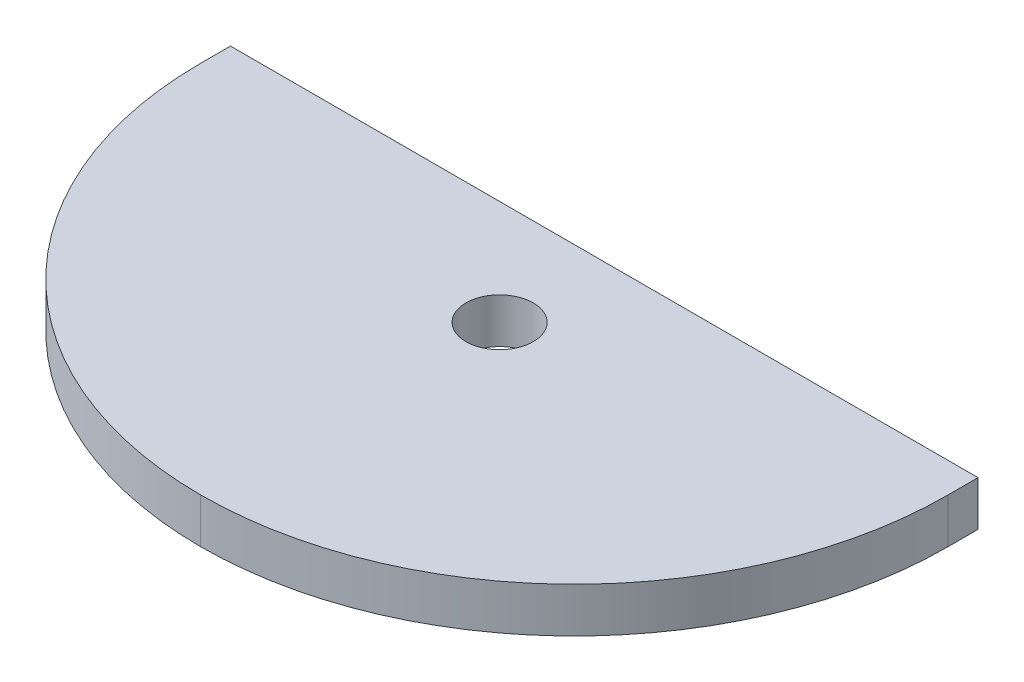
ISO-10303-21;
HEADER;
FILE_DESCRIPTION(('STEP AP214'),'2;1');
FILE_NAME('part.step','',(''),(''),'','','');
FILE_SCHEMA(('AUTOMOTIVE_DESIGN { 1 0 10303 214 1 1 1 1 }'));
ENDSEC;
DATA;
#1=APPLICATION_CONTEXT('core data for automotive mechanical design processes');
#2=APPLICATION_PROTOCOL_DEFINITION('international standard','automotive_design',2000,#1);
#3=PRODUCT_CONTEXT('',#1,'mechanical');
#4=PRODUCT('Part','Part','',(#3));
#5=PRODUCT_RELATED_PRODUCT_CATEGORY('part','',(#4));
#6=PRODUCT_DEFINITION_FORMATION('','',#4);
#7=PRODUCT_DEFINITION_CONTEXT('part definition',#1,'design');
#8=PRODUCT_DEFINITION('design','',#6,#7);
#9=PRODUCT_DEFINITION_SHAPE('','',#8);
#10=(LENGTH_UNIT() NAMED_UNIT(*) SI_UNIT(.MILLI.,.METRE.));
#11=(NAMED_UNIT(*) PLANE_ANGLE_UNIT() SI_UNIT($,.RADIAN.));
#12=(NAMED_UNIT(*) SI_UNIT($,.STERADIAN.) SOLID_ANGLE_UNIT());
#13=UNCERTAINTY_MEASURE_WITH_UNIT(LENGTH_MEASURE(1.E-05),#10,'distance_accuracy_value','');
#14=(GEOMETRIC_REPRESENTATION_CONTEXT(3) GLOBAL_UNCERTAINTY_ASSIGNED_CONTEXT((#13)) GLOBAL_UNIT_ASSIGNED_CONTEXT((#10,
#11,#12)) REPRESENTATION_CONTEXT('',''));
#15=CARTESIAN_POINT('',(0.,0.,0.));
#16=DIRECTION('',(0.,0.,1.));
#17=DIRECTION('',(1.,0.,0.));
#18=AXIS2_PLACEMENT_3D('',#15,#16,#17);
#19=CARTESIAN_POINT('',(0.,3.,0.));
#20=DIRECTION('',(1.,0.,0.));
#21=DIRECTION('',(0.,0.,-1.));
#22=AXIS2_PLACEMENT_3D('',#19,#20,#21);
#23=PLANE('',#22);
#24=DIRECTION('',(0.,0.,1.));
#25=VECTOR('',#24,1.);
#26=CARTESIAN_POINT('',(0.,0.,0.));
#27=LINE('',#26,#25);
#28=CARTESIAN_POINT('',(0.,0.,-27.));
#29=VERTEX_POINT('',#28);
#30=CARTESIAN_POINT('',(0.,0.,-25.));
#31=VERTEX_POINT('',#30);
#32=EDGE_CURVE('E107',#29,#31,#27,.T.);
#33=ORIENTED_EDGE('',*,*,#32,.T.);
#34=DIRECTION('',(0.,-1.,0.));
#35=VECTOR('',#34,1.);
#36=CARTESIAN_POINT('',(0.,3.,-25.));
#37=LINE('',#36,#35);
#38=CARTESIAN_POINT('',(0.,3.,-25.));
#39=VERTEX_POINT('',#38);
#40=EDGE_CURVE('E11',#31,#39,#37,.F.);
#41=ORIENTED_EDGE('',*,*,#40,.T.);
#42=DIRECTION('',(0.,0.,1.));
#43=VECTOR('',#42,1.);
#44=CARTESIAN_POINT('',(0.,3.,0.));
#45=LINE('',#44,#43);
#46=CARTESIAN_POINT('',(0.,3.,-27.));
#47=VERTEX_POINT('',#46);
#48=EDGE_CURVE('E89',#47,#39,#45,.T.);
#49=ORIENTED_EDGE('',*,*,#48,.F.);
#50=DIRECTION('',(0.,-1.,0.));
#51=VECTOR('',#50,1.);
#52=CARTESIAN_POINT('',(0.,3.,-27.));
#53=LINE('',#52,#51);
#54=EDGE_CURVE('E99',#47,#29,#53,.T.);
#55=ORIENTED_EDGE('',*,*,#54,.T.);
#56=EDGE_LOOP('',(#33,#41,#49,#55));
#57=FACE_BOUND('',#56,.T.);
#58=ADVANCED_FACE('F33',(#57),#23,.F.);
#59=CARTESIAN_POINT('',(50.,3.,0.));
#60=DIRECTION('',(-1.,0.,0.));
#61=DIRECTION('',(0.,0.,1.));
#62=AXIS2_PLACEMENT_3D('',#59,#60,#61);
#63=PLANE('',#62);
#64=DIRECTION('',(0.,0.,-1.));
#65=VECTOR('',#64,1.);
#66=CARTESIAN_POINT('',(50.,3.,0.));
#67=LINE('',#66,#65);
#68=CARTESIAN_POINT('',(50.,3.,-25.));
#69=VERTEX_POINT('',#68);
#70=CARTESIAN_POINT('',(50.,3.,-27.));
#71=VERTEX_POINT('',#70);
#72=EDGE_CURVE('E79',#69,#71,#67,.T.);
#73=ORIENTED_EDGE('',*,*,#72,.F.);
#74=DIRECTION('',(0.,-1.,0.));
#75=VECTOR('',#74,1.);
#76=CARTESIAN_POINT('',(50.,3.,-25.));
#77=LINE('',#76,#75);
#78=CARTESIAN_POINT('',(50.,0.,-25.));
#79=VERTEX_POINT('',#78);
#80=EDGE_CURVE('E98',#69,#79,#77,.T.);
#81=ORIENTED_EDGE('',*,*,#80,.T.);
#82=DIRECTION('',(0.,0.,-1.));
#83=VECTOR('',#82,1.);
#84=CARTESIAN_POINT('',(50.,0.,0.));
#85=LINE('',#84,#83);
#86=CARTESIAN_POINT('',(50.,0.,-27.));
#87=VERTEX_POINT('',#86);
#88=EDGE_CURVE('E95',#79,#87,#85,.T.);
#89=ORIENTED_EDGE('',*,*,#88,.T.);
#90=DIRECTION('',(0.,-1.,0.));
#91=VECTOR('',#90,1.);
#92=CARTESIAN_POINT('',(50.,3.,-27.));
#93=LINE('',#92,#91);
#94=EDGE_CURVE('E92',#71,#87,#93,.T.);
#95=ORIENTED_EDGE('',*,*,#94,.F.);
#96=EDGE_LOOP('',(#73,#81,#89,#95));
#97=FACE_BOUND('',#96,.T.);
#98=ADVANCED_FACE('F93',(#97),#63,.F.);
#99=CARTESIAN_POINT('',(0.,3.,-27.));
#100=DIRECTION('',(0.,0.,1.));
#101=DIRECTION('',(1.,0.,0.));
#102=AXIS2_PLACEMENT_3D('',#99,#100,#101);
#103=PLANE('',#102);
#104=DIRECTION('',(-1.,0.,0.));
#105=VECTOR('',#104,1.);
#106=CARTESIAN_POINT('',(0.,0.,-27.));
#107=LINE('',#106,#105);
#108=EDGE_CURVE('E110',#87,#29,#107,.T.);
#109=ORIENTED_EDGE('',*,*,#108,.T.);
#110=ORIENTED_EDGE('',*,*,#54,.F.);
#111=DIRECTION('',(-1.,0.,0.));
#112=VECTOR('',#111,1.);
#113=CARTESIAN_POINT('',(0.,3.,-27.));
#114=LINE('',#113,#112);
#115=EDGE_CURVE('E83',#71,#47,#114,.T.);
#116=ORIENTED_EDGE('',*,*,#115,.F.);
#117=ORIENTED_EDGE('',*,*,#94,.T.);
#118=EDGE_LOOP('',(#109,#110,#116,#117));
#119=FACE_BOUND('',#118,.T.);
#120=ADVANCED_FACE('F101',(#119),#103,.F.);
#121=CARTESIAN_POINT('',(0.,3.,0.));
#122=DIRECTION('',(0.,-1.,0.));
#123=DIRECTION('',(0.,0.,-1.));
#124=AXIS2_PLACEMENT_3D('',#121,#122,#123);
#125=PLANE('',#124);
#126=CARTESIAN_POINT('',(25.,3.,-20.));
#127=DIRECTION('',(0.,1.,0.));
#128=DIRECTION('',(0.,0.,1.));
#129=AXIS2_PLACEMENT_3D('',#126,#127,#128);
#130=CIRCLE('',#129,2.25);
#131=CARTESIAN_POINT('',(25.,3.,-17.75));
#132=VERTEX_POINT('',#131);
#133=EDGE_CURVE('E128',#132,#132,#130,.T.);
#134=ORIENTED_EDGE('',*,*,#133,.F.);
#135=EDGE_LOOP('',(#134));
#136=FACE_BOUND('',#135,.T.);
#137=CARTESIAN_POINT('',(25.,3.,-25.));
#138=DIRECTION('',(0.,-1.,0.));
#139=DIRECTION('',(0.,0.,-1.));
#140=AXIS2_PLACEMENT_3D('',#137,#138,#139);
#141=CIRCLE('',#140,25.);
#142=CARTESIAN_POINT('',(25.,3.,0.));
#143=VERTEX_POINT('',#142);
#144=EDGE_CURVE('E49',#39,#143,#141,.F.);
#145=ORIENTED_EDGE('',*,*,#144,.T.);
#146=CARTESIAN_POINT('',(25.,3.,-25.));
#147=DIRECTION('',(0.,-1.,0.));
#148=DIRECTION('',(0.,0.,-1.));
#149=AXIS2_PLACEMENT_3D('',#146,#147,#148);
#150=CIRCLE('',#149,25.);
#151=EDGE_CURVE('E42',#143,#69,#150,.F.);
#152=ORIENTED_EDGE('',*,*,#151,.T.);
#153=ORIENTED_EDGE('',*,*,#72,.T.);
#154=ORIENTED_EDGE('',*,*,#115,.T.);
#155=ORIENTED_EDGE('',*,*,#48,.T.);
#156=EDGE_LOOP('',(#145,#152,#153,#154,#155));
#157=FACE_BOUND('',#156,.T.);
#158=ADVANCED_FACE('F81',(#136,#157),#125,.F.);
#159=CARTESIAN_POINT('',(0.,0.,0.));
#160=DIRECTION('',(0.,-1.,0.));
#161=DIRECTION('',(0.,0.,-1.));
#162=AXIS2_PLACEMENT_3D('',#159,#160,#161);
#163=PLANE('',#162);
#164=CARTESIAN_POINT('',(25.,0.,-20.));
#165=DIRECTION('',(0.,1.,0.));
#166=DIRECTION('',(0.,0.,1.));
#167=AXIS2_PLACEMENT_3D('',#164,#165,#166);
#168=CIRCLE('',#167,2.25);
#169=CARTESIAN_POINT('',(25.,0.,-17.75));
#170=VERTEX_POINT('',#169);
#171=EDGE_CURVE('E126',#170,#170,#168,.T.);
#172=ORIENTED_EDGE('',*,*,#171,.T.);
#173=EDGE_LOOP('',(#172));
#174=FACE_BOUND('',#173,.T.);
#175=ORIENTED_EDGE('',*,*,#88,.F.);
#176=CARTESIAN_POINT('',(25.,0.,-25.));
#177=DIRECTION('',(0.,-1.,0.));
#178=DIRECTION('',(0.,0.,-1.));
#179=AXIS2_PLACEMENT_3D('',#176,#177,#178);
#180=CIRCLE('',#179,25.);
#181=CARTESIAN_POINT('',(25.,0.,0.));
#182=VERTEX_POINT('',#181);
#183=EDGE_CURVE('E115',#79,#182,#180,.T.);
#184=ORIENTED_EDGE('',*,*,#183,.T.);
#185=CARTESIAN_POINT('',(25.,0.,-25.));
#186=DIRECTION('',(0.,-1.,0.));
#187=DIRECTION('',(0.,0.,-1.));
#188=AXIS2_PLACEMENT_3D('',#185,#186,#187);
#189=CIRCLE('',#188,25.);
#190=EDGE_CURVE('E113',#182,#31,#189,.T.);
#191=ORIENTED_EDGE('',*,*,#190,.T.);
#192=ORIENTED_EDGE('',*,*,#32,.F.);
#193=ORIENTED_EDGE('',*,*,#108,.F.);
#194=EDGE_LOOP('',(#175,#184,#191,#192,#193));
#195=FACE_BOUND('',#194,.T.);
#196=ADVANCED_FACE('F120',(#174,#195),#163,.T.);
#197=CARTESIAN_POINT('',(25.,3.,-25.));
#198=DIRECTION('',(0.,-1.,0.));
#199=DIRECTION('',(0.,0.,-1.));
#200=AXIS2_PLACEMENT_3D('',#197,#198,#199);
#201=CYLINDRICAL_SURFACE('',#200,25.);
#202=DIRECTION('',(0.,-1.,0.));
#203=VECTOR('',#202,1.);
#204=CARTESIAN_POINT('',(25.,3.,0.));
#205=LINE('',#204,#203);
#206=EDGE_CURVE('E37',#143,#182,#205,.T.);
#207=ORIENTED_EDGE('',*,*,#206,.F.);
#208=ORIENTED_EDGE('',*,*,#144,.F.);
#209=ORIENTED_EDGE('',*,*,#40,.F.);
#210=ORIENTED_EDGE('',*,*,#190,.F.);
#211=EDGE_LOOP('',(#207,#208,#209,#210));
#212=FACE_BOUND('',#211,.T.);
#213=ADVANCED_FACE('F35',(#212),#201,.T.);
#214=CARTESIAN_POINT('',(25.,3.,-25.));
#215=DIRECTION('',(0.,-1.,0.));
#216=DIRECTION('',(0.,0.,-1.));
#217=AXIS2_PLACEMENT_3D('',#214,#215,#216);
#218=CYLINDRICAL_SURFACE('',#217,25.);
#219=ORIENTED_EDGE('',*,*,#151,.F.);
#220=ORIENTED_EDGE('',*,*,#206,.T.);
#221=ORIENTED_EDGE('',*,*,#183,.F.);
#222=ORIENTED_EDGE('',*,*,#80,.F.);
#223=EDGE_LOOP('',(#219,#220,#221,#222));
#224=FACE_BOUND('',#223,.T.);
#225=ADVANCED_FACE('F125',(#224),#218,.T.);
#226=CARTESIAN_POINT('',(25.,3.,-20.));
#227=DIRECTION('',(0.,1.,0.));
#228=DIRECTION('',(0.,0.,1.));
#229=AXIS2_PLACEMENT_3D('',#226,#227,#228);
#230=CYLINDRICAL_SURFACE('',#229,2.25);
#231=ORIENTED_EDGE('',*,*,#171,.F.);
#232=EDGE_LOOP('',(#231));
#233=FACE_BOUND('',#232,.T.);
#234=ORIENTED_EDGE('',*,*,#133,.T.);
#235=EDGE_LOOP('',(#234));
#236=FACE_BOUND('',#235,.T.);
#237=ADVANCED_FACE('F142',(#233,#236),#230,.F.);
#238=CLOSED_SHELL('',(#58,#98,#120,#158,#196,#213,#225,#237));
#239=MANIFOLD_SOLID_BREP('B2',#238);
#240=ADVANCED_BREP_SHAPE_REPRESENTATION('',(#18,#239),#14);
#241=SHAPE_DEFINITION_REPRESENTATION(#9,#240);
ENDSEC;
END-ISO-10303-21;
